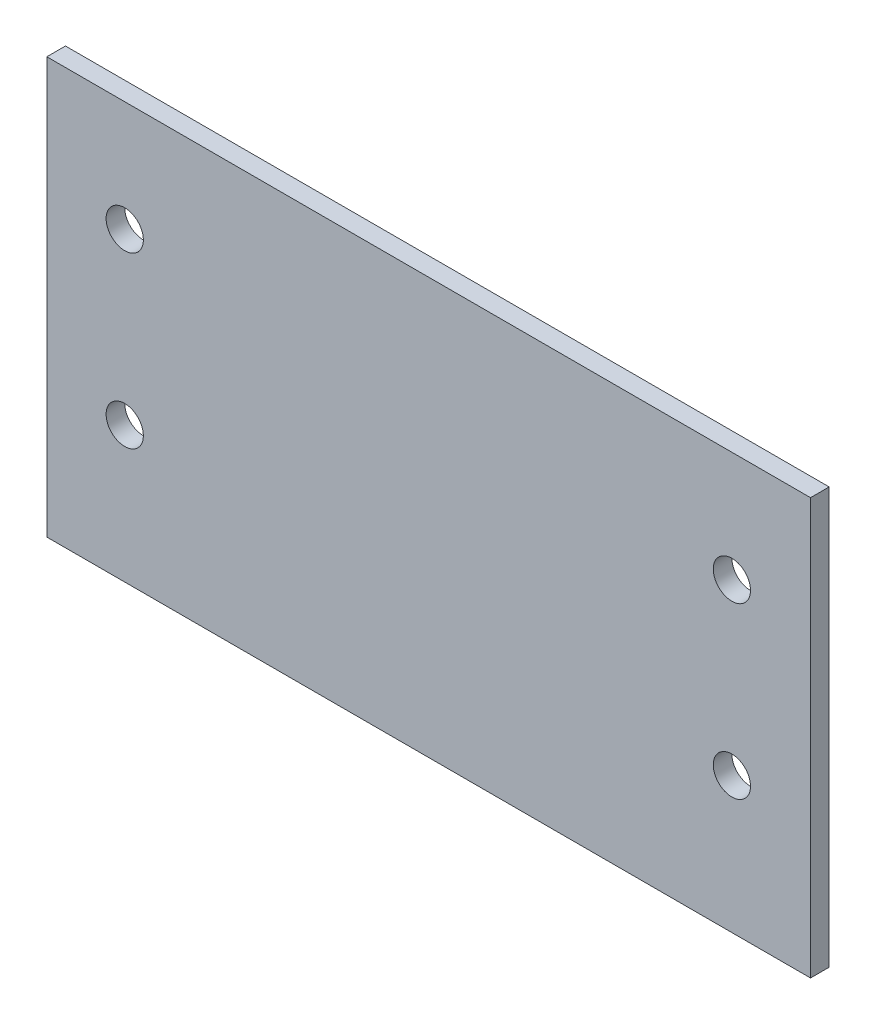
ISO-10303-21;
HEADER;
FILE_DESCRIPTION(('STEP AP214'),'2;1');
FILE_NAME('part.step','',(''),(''),'','','');
FILE_SCHEMA(('AUTOMOTIVE_DESIGN { 1 0 10303 214 1 1 1 1 }'));
ENDSEC;
DATA;
#1=APPLICATION_CONTEXT('core data for automotive mechanical design processes');
#2=APPLICATION_PROTOCOL_DEFINITION('international standard','automotive_design',2000,#1);
#3=PRODUCT_CONTEXT('',#1,'mechanical');
#4=PRODUCT('Part','Part','',(#3));
#5=PRODUCT_RELATED_PRODUCT_CATEGORY('part','',(#4));
#6=PRODUCT_DEFINITION_FORMATION('','',#4);
#7=PRODUCT_DEFINITION_CONTEXT('part definition',#1,'design');
#8=PRODUCT_DEFINITION('design','',#6,#7);
#9=PRODUCT_DEFINITION_SHAPE('','',#8);
#10=(LENGTH_UNIT() NAMED_UNIT(*) SI_UNIT(.MILLI.,.METRE.));
#11=(NAMED_UNIT(*) PLANE_ANGLE_UNIT() SI_UNIT($,.RADIAN.));
#12=(NAMED_UNIT(*) SI_UNIT($,.STERADIAN.) SOLID_ANGLE_UNIT());
#13=UNCERTAINTY_MEASURE_WITH_UNIT(LENGTH_MEASURE(1.E-05),#10,'distance_accuracy_value','');
#14=(GEOMETRIC_REPRESENTATION_CONTEXT(3) GLOBAL_UNCERTAINTY_ASSIGNED_CONTEXT((#13)) GLOBAL_UNIT_ASSIGNED_CONTEXT((#10,
#11,#12)) REPRESENTATION_CONTEXT('',''));
#15=CARTESIAN_POINT('',(0.,0.,0.));
#16=DIRECTION('',(0.,0.,1.));
#17=DIRECTION('',(1.,0.,0.));
#18=AXIS2_PLACEMENT_3D('',#15,#16,#17);
#19=CARTESIAN_POINT('',(107.33304022333,46.215822366703,-3.5));
#20=DIRECTION('',(0.,0.,-1.));
#21=DIRECTION('',(1.,0.,0.));
#22=AXIS2_PLACEMENT_3D('',#19,#20,#21);
#23=CYLINDRICAL_SURFACE('',#22,3.);
#24=CARTESIAN_POINT('',(107.33304022333,46.215822366703,-3.));
#25=DIRECTION('',(0.,0.,-1.));
#26=DIRECTION('',(1.,0.,0.));
#27=AXIS2_PLACEMENT_3D('',#24,#25,#26);
#28=CIRCLE('',#27,3.);
#29=CARTESIAN_POINT('',(110.33304022333,46.215822366703,-3.));
#30=VERTEX_POINT('',#29);
#31=EDGE_CURVE('E175',#30,#30,#28,.T.);
#32=ORIENTED_EDGE('',*,*,#31,.T.);
#33=DIRECTION('',(0.,0.,1.));
#34=VECTOR('',#33,1.);
#35=CARTESIAN_POINT('',(110.33304022333,46.215822366703,-3.5));
#36=LINE('',#35,#34);
#37=CARTESIAN_POINT('',(110.33304022333,46.215822366703,0.));
#38=VERTEX_POINT('',#37);
#39=EDGE_CURVE('E9',#30,#38,#36,.T.);
#40=ORIENTED_EDGE('',*,*,#39,.T.);
#41=CARTESIAN_POINT('',(107.33304022333,46.215822366703,0.));
#42=DIRECTION('',(0.,0.,-1.));
#43=DIRECTION('',(1.,0.,0.));
#44=AXIS2_PLACEMENT_3D('',#41,#42,#43);
#45=CIRCLE('',#44,3.);
#46=EDGE_CURVE('E162',#38,#38,#45,.T.);
#47=ORIENTED_EDGE('',*,*,#46,.F.);
#48=ORIENTED_EDGE('',*,*,#39,.F.);
#49=EDGE_LOOP('',(#32,#40,#47,#48));
#50=FACE_BOUND('',#49,.T.);
#51=ADVANCED_FACE('F15',(#50),#23,.F.);
#52=CARTESIAN_POINT('',(9.543041215151,46.215822366703,-3.5));
#53=DIRECTION('',(0.,0.,-1.));
#54=DIRECTION('',(1.,0.,0.));
#55=AXIS2_PLACEMENT_3D('',#52,#53,#54);
#56=CYLINDRICAL_SURFACE('',#55,3.);
#57=CARTESIAN_POINT('',(9.543041215151,46.215822366703,-3.));
#58=DIRECTION('',(0.,0.,-1.));
#59=DIRECTION('',(1.,0.,0.));
#60=AXIS2_PLACEMENT_3D('',#57,#58,#59);
#61=CIRCLE('',#60,3.);
#62=CARTESIAN_POINT('',(12.543041215151,46.215822366703,-3.));
#63=VERTEX_POINT('',#62);
#64=EDGE_CURVE('E130',#63,#63,#61,.T.);
#65=ORIENTED_EDGE('',*,*,#64,.T.);
#66=DIRECTION('',(0.,0.,1.));
#67=VECTOR('',#66,1.);
#68=CARTESIAN_POINT('',(12.543041215151,46.215822366703,-3.5));
#69=LINE('',#68,#67);
#70=CARTESIAN_POINT('',(12.543041215151,46.215822366703,0.));
#71=VERTEX_POINT('',#70);
#72=EDGE_CURVE('E24',#63,#71,#69,.T.);
#73=ORIENTED_EDGE('',*,*,#72,.T.);
#74=CARTESIAN_POINT('',(9.543041215151,46.215822366703,0.));
#75=DIRECTION('',(0.,0.,-1.));
#76=DIRECTION('',(1.,0.,0.));
#77=AXIS2_PLACEMENT_3D('',#74,#75,#76);
#78=CIRCLE('',#77,3.);
#79=EDGE_CURVE('E134',#71,#71,#78,.T.);
#80=ORIENTED_EDGE('',*,*,#79,.F.);
#81=ORIENTED_EDGE('',*,*,#72,.F.);
#82=EDGE_LOOP('',(#65,#73,#80,#81));
#83=FACE_BOUND('',#82,.T.);
#84=ADVANCED_FACE('F188',(#83),#56,.F.);
#85=CARTESIAN_POINT('',(107.33304022333,18.910823968876,-3.5));
#86=DIRECTION('',(0.,0.,-1.));
#87=DIRECTION('',(1.,0.,0.));
#88=AXIS2_PLACEMENT_3D('',#85,#86,#87);
#89=CYLINDRICAL_SURFACE('',#88,3.);
#90=CARTESIAN_POINT('',(107.33304022333,18.910823968876,-3.));
#91=DIRECTION('',(0.,0.,-1.));
#92=DIRECTION('',(1.,0.,0.));
#93=AXIS2_PLACEMENT_3D('',#90,#91,#92);
#94=CIRCLE('',#93,3.);
#95=CARTESIAN_POINT('',(110.33304022333,18.910823968876,-3.));
#96=VERTEX_POINT('',#95);
#97=EDGE_CURVE('E139',#96,#96,#94,.T.);
#98=ORIENTED_EDGE('',*,*,#97,.T.);
#99=DIRECTION('',(0.,0.,1.));
#100=VECTOR('',#99,1.);
#101=CARTESIAN_POINT('',(110.33304022333,18.910823968876,-3.5));
#102=LINE('',#101,#100);
#103=CARTESIAN_POINT('',(110.33304022333,18.910823968876,0.));
#104=VERTEX_POINT('',#103);
#105=EDGE_CURVE('E181',#96,#104,#102,.T.);
#106=ORIENTED_EDGE('',*,*,#105,.T.);
#107=CARTESIAN_POINT('',(107.33304022333,18.910823968876,0.));
#108=DIRECTION('',(0.,0.,-1.));
#109=DIRECTION('',(1.,0.,0.));
#110=AXIS2_PLACEMENT_3D('',#107,#108,#109);
#111=CIRCLE('',#110,3.);
#112=EDGE_CURVE('E131',#104,#104,#111,.T.);
#113=ORIENTED_EDGE('',*,*,#112,.F.);
#114=ORIENTED_EDGE('',*,*,#105,.F.);
#115=EDGE_LOOP('',(#98,#106,#113,#114));
#116=FACE_BOUND('',#115,.T.);
#117=ADVANCED_FACE('F218',(#116),#89,.F.);
#118=CARTESIAN_POINT('',(9.543041215151,18.910823968876,-3.5));
#119=DIRECTION('',(0.,0.,-1.));
#120=DIRECTION('',(1.,0.,0.));
#121=AXIS2_PLACEMENT_3D('',#118,#119,#120);
#122=CYLINDRICAL_SURFACE('',#121,3.);
#123=CARTESIAN_POINT('',(9.543041215151,18.910823968876,-3.));
#124=DIRECTION('',(0.,0.,-1.));
#125=DIRECTION('',(1.,0.,0.));
#126=AXIS2_PLACEMENT_3D('',#123,#124,#125);
#127=CIRCLE('',#126,3.);
#128=CARTESIAN_POINT('',(12.543041215151,18.910823968876,-3.));
#129=VERTEX_POINT('',#128);
#130=EDGE_CURVE('E142',#129,#129,#127,.T.);
#131=ORIENTED_EDGE('',*,*,#130,.T.);
#132=DIRECTION('',(0.,0.,1.));
#133=VECTOR('',#132,1.);
#134=CARTESIAN_POINT('',(12.543041215151,18.910823968876,-3.5));
#135=LINE('',#134,#133);
#136=CARTESIAN_POINT('',(12.543041215151,18.910823968876,0.));
#137=VERTEX_POINT('',#136);
#138=EDGE_CURVE('E178',#129,#137,#135,.T.);
#139=ORIENTED_EDGE('',*,*,#138,.T.);
#140=CARTESIAN_POINT('',(9.543041215151,18.910823968876,0.));
#141=DIRECTION('',(0.,0.,-1.));
#142=DIRECTION('',(1.,0.,0.));
#143=AXIS2_PLACEMENT_3D('',#140,#141,#142);
#144=CIRCLE('',#143,3.);
#145=EDGE_CURVE('E135',#137,#137,#144,.T.);
#146=ORIENTED_EDGE('',*,*,#145,.F.);
#147=ORIENTED_EDGE('',*,*,#138,.F.);
#148=EDGE_LOOP('',(#131,#139,#146,#147));
#149=FACE_BOUND('',#148,.T.);
#150=ADVANCED_FACE('F200',(#149),#122,.F.);
#151=CARTESIAN_POINT('',(120.,-3.,-3.));
#152=DIRECTION('',(1.,0.,0.));
#153=DIRECTION('',(0.,1.,0.));
#154=AXIS2_PLACEMENT_3D('',#151,#152,#153);
#155=PLANE('',#154);
#156=DIRECTION('',(0.,0.,1.));
#157=VECTOR('',#156,1.);
#158=CARTESIAN_POINT('',(120.,-3.,-3.));
#159=LINE('',#158,#157);
#160=CARTESIAN_POINT('',(120.,-3.,-3.));
#161=VERTEX_POINT('',#160);
#162=CARTESIAN_POINT('',(120.,-3.,0.));
#163=VERTEX_POINT('',#162);
#164=EDGE_CURVE('E100',#161,#163,#159,.T.);
#165=ORIENTED_EDGE('',*,*,#164,.F.);
#166=DIRECTION('',(0.,1.,0.));
#167=VECTOR('',#166,1.);
#168=CARTESIAN_POINT('',(120.,-3.,-3.));
#169=LINE('',#168,#167);
#170=CARTESIAN_POINT('',(120.,64.,-3.));
#171=VERTEX_POINT('',#170);
#172=EDGE_CURVE('E150',#161,#171,#169,.T.);
#173=ORIENTED_EDGE('',*,*,#172,.T.);
#174=DIRECTION('',(0.,0.,1.));
#175=VECTOR('',#174,1.);
#176=CARTESIAN_POINT('',(120.,64.,-3.));
#177=LINE('',#176,#175);
#178=CARTESIAN_POINT('',(120.,64.,0.));
#179=VERTEX_POINT('',#178);
#180=EDGE_CURVE('E153',#171,#179,#177,.T.);
#181=ORIENTED_EDGE('',*,*,#180,.T.);
#182=DIRECTION('',(0.,1.,0.));
#183=VECTOR('',#182,1.);
#184=CARTESIAN_POINT('',(120.,-3.,0.));
#185=LINE('',#184,#183);
#186=EDGE_CURVE('E136',#163,#179,#185,.T.);
#187=ORIENTED_EDGE('',*,*,#186,.F.);
#188=EDGE_LOOP('',(#165,#173,#181,#187));
#189=FACE_BOUND('',#188,.T.);
#190=ADVANCED_FACE('F206',(#189),#155,.T.);
#191=CARTESIAN_POINT('',(-3.,-3.,-3.));
#192=DIRECTION('',(0.,0.,1.));
#193=DIRECTION('',(1.,0.,0.));
#194=AXIS2_PLACEMENT_3D('',#191,#192,#193);
#195=PLANE('',#194);
#196=ORIENTED_EDGE('',*,*,#31,.F.);
#197=EDGE_LOOP('',(#196));
#198=FACE_BOUND('',#197,.T.);
#199=ORIENTED_EDGE('',*,*,#64,.F.);
#200=EDGE_LOOP('',(#199));
#201=FACE_BOUND('',#200,.T.);
#202=ORIENTED_EDGE('',*,*,#97,.F.);
#203=EDGE_LOOP('',(#202));
#204=FACE_BOUND('',#203,.T.);
#205=ORIENTED_EDGE('',*,*,#130,.F.);
#206=EDGE_LOOP('',(#205));
#207=FACE_BOUND('',#206,.T.);
#208=DIRECTION('',(1.,0.,0.));
#209=VECTOR('',#208,1.);
#210=CARTESIAN_POINT('',(-3.,64.,-3.));
#211=LINE('',#210,#209);
#212=CARTESIAN_POINT('',(-3.,64.,-3.));
#213=VERTEX_POINT('',#212);
#214=EDGE_CURVE('E166',#213,#171,#211,.T.);
#215=ORIENTED_EDGE('',*,*,#214,.T.);
#216=ORIENTED_EDGE('',*,*,#172,.F.);
#217=DIRECTION('',(1.,0.,0.));
#218=VECTOR('',#217,1.);
#219=CARTESIAN_POINT('',(-3.,-3.,-3.));
#220=LINE('',#219,#218);
#221=CARTESIAN_POINT('',(-3.,-3.,-3.));
#222=VERTEX_POINT('',#221);
#223=EDGE_CURVE('E105',#222,#161,#220,.T.);
#224=ORIENTED_EDGE('',*,*,#223,.F.);
#225=DIRECTION('',(0.,1.,0.));
#226=VECTOR('',#225,1.);
#227=CARTESIAN_POINT('',(-3.,-3.,-3.));
#228=LINE('',#227,#226);
#229=EDGE_CURVE('E113',#222,#213,#228,.T.);
#230=ORIENTED_EDGE('',*,*,#229,.T.);
#231=EDGE_LOOP('',(#215,#216,#224,#230));
#232=FACE_BOUND('',#231,.T.);
#233=ADVANCED_FACE('F203',(#198,#201,#204,#207,#232),#195,.F.);
#234=CARTESIAN_POINT('',(-3.,64.,-3.));
#235=DIRECTION('',(0.,1.,0.));
#236=DIRECTION('',(1.,0.,0.));
#237=AXIS2_PLACEMENT_3D('',#234,#235,#236);
#238=PLANE('',#237);
#239=ORIENTED_EDGE('',*,*,#214,.F.);
#240=DIRECTION('',(0.,0.,1.));
#241=VECTOR('',#240,1.);
#242=CARTESIAN_POINT('',(-3.,64.,-3.));
#243=LINE('',#242,#241);
#244=CARTESIAN_POINT('',(-3.,64.,0.));
#245=VERTEX_POINT('',#244);
#246=EDGE_CURVE('E121',#213,#245,#243,.T.);
#247=ORIENTED_EDGE('',*,*,#246,.T.);
#248=DIRECTION('',(1.,0.,0.));
#249=VECTOR('',#248,1.);
#250=CARTESIAN_POINT('',(-3.,64.,0.));
#251=LINE('',#250,#249);
#252=EDGE_CURVE('E118',#245,#179,#251,.T.);
#253=ORIENTED_EDGE('',*,*,#252,.T.);
#254=ORIENTED_EDGE('',*,*,#180,.F.);
#255=EDGE_LOOP('',(#239,#247,#253,#254));
#256=FACE_BOUND('',#255,.T.);
#257=ADVANCED_FACE('F193',(#256),#238,.T.);
#258=CARTESIAN_POINT('',(-3.,-3.,0.));
#259=DIRECTION('',(0.,0.,1.));
#260=DIRECTION('',(1.,0.,0.));
#261=AXIS2_PLACEMENT_3D('',#258,#259,#260);
#262=PLANE('',#261);
#263=ORIENTED_EDGE('',*,*,#46,.T.);
#264=EDGE_LOOP('',(#263));
#265=FACE_BOUND('',#264,.T.);
#266=ORIENTED_EDGE('',*,*,#79,.T.);
#267=EDGE_LOOP('',(#266));
#268=FACE_BOUND('',#267,.T.);
#269=ORIENTED_EDGE('',*,*,#112,.T.);
#270=EDGE_LOOP('',(#269));
#271=FACE_BOUND('',#270,.T.);
#272=ORIENTED_EDGE('',*,*,#145,.T.);
#273=EDGE_LOOP('',(#272));
#274=FACE_BOUND('',#273,.T.);
#275=DIRECTION('',(0.,1.,0.));
#276=VECTOR('',#275,1.);
#277=CARTESIAN_POINT('',(-3.,-3.,0.));
#278=LINE('',#277,#276);
#279=CARTESIAN_POINT('',(-3.,-3.,0.));
#280=VERTEX_POINT('',#279);
#281=EDGE_CURVE('E111',#280,#245,#278,.T.);
#282=ORIENTED_EDGE('',*,*,#281,.F.);
#283=DIRECTION('',(1.,0.,0.));
#284=VECTOR('',#283,1.);
#285=CARTESIAN_POINT('',(-3.,-3.,0.));
#286=LINE('',#285,#284);
#287=EDGE_CURVE('E93',#280,#163,#286,.T.);
#288=ORIENTED_EDGE('',*,*,#287,.T.);
#289=ORIENTED_EDGE('',*,*,#186,.T.);
#290=ORIENTED_EDGE('',*,*,#252,.F.);
#291=EDGE_LOOP('',(#282,#288,#289,#290));
#292=FACE_BOUND('',#291,.T.);
#293=ADVANCED_FACE('F116',(#265,#268,#271,#274,#292),#262,.T.);
#294=CARTESIAN_POINT('',(-3.,-3.,-3.));
#295=DIRECTION('',(0.,1.,0.));
#296=DIRECTION('',(1.,0.,0.));
#297=AXIS2_PLACEMENT_3D('',#294,#295,#296);
#298=PLANE('',#297);
#299=ORIENTED_EDGE('',*,*,#164,.T.);
#300=ORIENTED_EDGE('',*,*,#287,.F.);
#301=DIRECTION('',(0.,0.,1.));
#302=VECTOR('',#301,1.);
#303=CARTESIAN_POINT('',(-3.,-3.,-3.));
#304=LINE('',#303,#302);
#305=EDGE_CURVE('E97',#222,#280,#304,.T.);
#306=ORIENTED_EDGE('',*,*,#305,.F.);
#307=ORIENTED_EDGE('',*,*,#223,.T.);
#308=EDGE_LOOP('',(#299,#300,#306,#307));
#309=FACE_BOUND('',#308,.T.);
#310=ADVANCED_FACE('F95',(#309),#298,.F.);
#311=CARTESIAN_POINT('',(-3.,-3.,-3.));
#312=DIRECTION('',(1.,0.,0.));
#313=DIRECTION('',(0.,1.,0.));
#314=AXIS2_PLACEMENT_3D('',#311,#312,#313);
#315=PLANE('',#314);
#316=ORIENTED_EDGE('',*,*,#281,.T.);
#317=ORIENTED_EDGE('',*,*,#246,.F.);
#318=ORIENTED_EDGE('',*,*,#229,.F.);
#319=ORIENTED_EDGE('',*,*,#305,.T.);
#320=EDGE_LOOP('',(#316,#317,#318,#319));
#321=FACE_BOUND('',#320,.T.);
#322=ADVANCED_FACE('F109',(#321),#315,.F.);
#323=CLOSED_SHELL('',(#51,#84,#117,#150,#190,#233,#257,#293,#310,#322));
#324=MANIFOLD_SOLID_BREP('B1',#323);
#325=ADVANCED_BREP_SHAPE_REPRESENTATION('',(#18,#324),#14);
#326=SHAPE_DEFINITION_REPRESENTATION(#9,#325);
ENDSEC;
END-ISO-10303-21;
